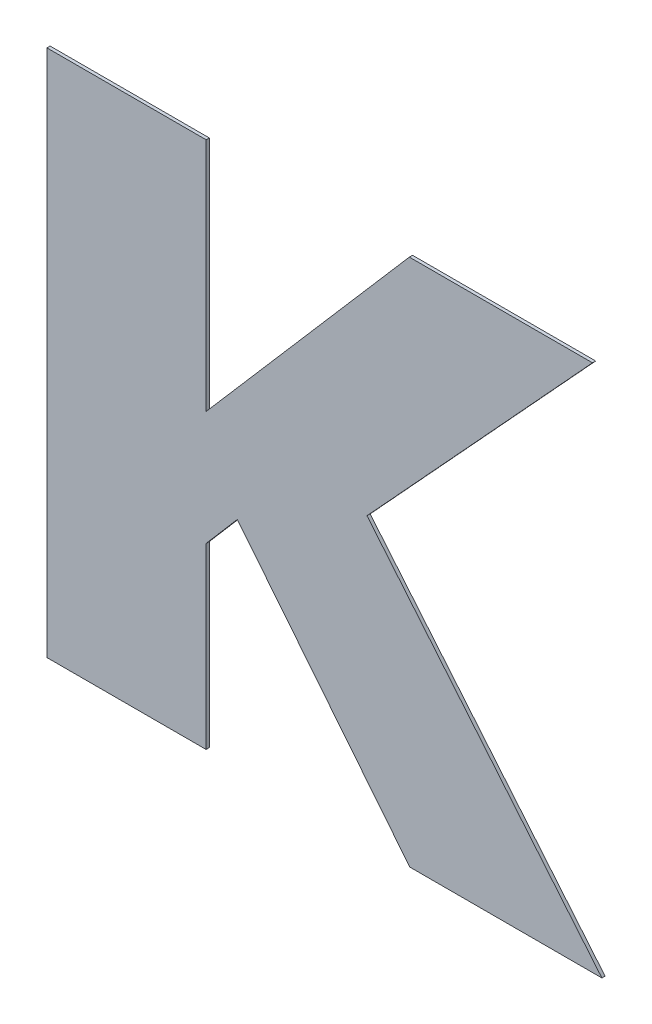
ISO-10303-21;
HEADER;
FILE_DESCRIPTION(('STEP AP214'),'2;1');
FILE_NAME('part.step','',(''),(''),'','','');
FILE_SCHEMA(('AUTOMOTIVE_DESIGN { 1 0 10303 214 1 1 1 1 }'));
ENDSEC;
DATA;
#1=APPLICATION_CONTEXT('core data for automotive mechanical design processes');
#2=APPLICATION_PROTOCOL_DEFINITION('international standard','automotive_design',2000,#1);
#3=PRODUCT_CONTEXT('',#1,'mechanical');
#4=PRODUCT('Part','Part','',(#3));
#5=PRODUCT_RELATED_PRODUCT_CATEGORY('part','',(#4));
#6=PRODUCT_DEFINITION_FORMATION('','',#4);
#7=PRODUCT_DEFINITION_CONTEXT('part definition',#1,'design');
#8=PRODUCT_DEFINITION('design','',#6,#7);
#9=PRODUCT_DEFINITION_SHAPE('','',#8);
#10=(LENGTH_UNIT() NAMED_UNIT(*) SI_UNIT(.MILLI.,.METRE.));
#11=(NAMED_UNIT(*) PLANE_ANGLE_UNIT() SI_UNIT($,.RADIAN.));
#12=(NAMED_UNIT(*) SI_UNIT($,.STERADIAN.) SOLID_ANGLE_UNIT());
#13=UNCERTAINTY_MEASURE_WITH_UNIT(LENGTH_MEASURE(1.E-05),#10,'distance_accuracy_value','');
#14=(GEOMETRIC_REPRESENTATION_CONTEXT(3) GLOBAL_UNCERTAINTY_ASSIGNED_CONTEXT((#13)) GLOBAL_UNIT_ASSIGNED_CONTEXT((#10,
#11,#12)) REPRESENTATION_CONTEXT('',''));
#15=CARTESIAN_POINT('',(0.,0.,0.));
#16=DIRECTION('',(0.,0.,1.));
#17=DIRECTION('',(1.,0.,0.));
#18=AXIS2_PLACEMENT_3D('',#15,#16,#17);
#19=CARTESIAN_POINT('',(2.058364911796,-2.493234605548,0.));
#20=DIRECTION('',(0.758626245570485,-0.65152606972525,0.));
#21=DIRECTION('',(0.65152606972525,0.758626245570485,0.));
#22=AXIS2_PLACEMENT_3D('',#19,#20,#21);
#23=PLANE('',#22);
#24=DIRECTION('',(0.65152606972525,0.758626245570484,0.));
#25=VECTOR('',#24,1.);
#26=CARTESIAN_POINT('',(2.058364911796,-2.493234605548,0.));
#27=LINE('',#26,#25);
#28=CARTESIAN_POINT('',(2.058364911796,-2.493234605548,0.));
#29=VERTEX_POINT('',#28);
#30=CARTESIAN_POINT('',(2.087918277855,-2.458823151917,0.));
#31=VERTEX_POINT('',#30);
#32=EDGE_CURVE('E11',#29,#31,#27,.T.);
#33=ORIENTED_EDGE('',*,*,#32,.T.);
#34=DIRECTION('',(0.,0.,1.));
#35=VECTOR('',#34,1.);
#36=CARTESIAN_POINT('',(2.087918277855,-2.458823151917,0.));
#37=LINE('',#36,#35);
#38=CARTESIAN_POINT('',(2.087918277855,-2.458823151917,0.003));
#39=VERTEX_POINT('',#38);
#40=EDGE_CURVE('E24',#31,#39,#37,.T.);
#41=ORIENTED_EDGE('',*,*,#40,.T.);
#42=DIRECTION('',(0.65152606972525,0.758626245570484,0.));
#43=VECTOR('',#42,1.);
#44=CARTESIAN_POINT('',(2.058364911796,-2.493234605548,0.003));
#45=LINE('',#44,#43);
#46=CARTESIAN_POINT('',(2.058364911796,-2.493234605548,0.003));
#47=VERTEX_POINT('',#46);
#48=EDGE_CURVE('E124',#47,#39,#45,.T.);
#49=ORIENTED_EDGE('',*,*,#48,.F.);
#50=DIRECTION('',(0.,0.,1.));
#51=VECTOR('',#50,1.);
#52=CARTESIAN_POINT('',(2.058364911796,-2.493234605548,0.));
#53=LINE('',#52,#51);
#54=EDGE_CURVE('E206',#29,#47,#53,.T.);
#55=ORIENTED_EDGE('',*,*,#54,.F.);
#56=EDGE_LOOP('',(#33,#41,#49,#55));
#57=FACE_BOUND('',#56,.T.);
#58=ADVANCED_FACE('F17',(#57),#23,.T.);
#59=CARTESIAN_POINT('',(2.058364911796,-2.662053148652,0.));
#60=DIRECTION('',(1.,0.,0.));
#61=DIRECTION('',(0.,1.,0.));
#62=AXIS2_PLACEMENT_3D('',#59,#60,#61);
#63=PLANE('',#62);
#64=DIRECTION('',(0.,1.,0.));
#65=VECTOR('',#64,1.);
#66=CARTESIAN_POINT('',(2.058364911796,-2.662053148652,0.));
#67=LINE('',#66,#65);
#68=CARTESIAN_POINT('',(2.058364911796,-2.662053148652,0.));
#69=VERTEX_POINT('',#68);
#70=EDGE_CURVE('E203',#69,#29,#67,.T.);
#71=ORIENTED_EDGE('',*,*,#70,.T.);
#72=ORIENTED_EDGE('',*,*,#54,.T.);
#73=DIRECTION('',(0.,1.,0.));
#74=VECTOR('',#73,1.);
#75=CARTESIAN_POINT('',(2.058364911796,-2.662053148652,0.003));
#76=LINE('',#75,#74);
#77=CARTESIAN_POINT('',(2.058364911796,-2.662053148652,0.003));
#78=VERTEX_POINT('',#77);
#79=EDGE_CURVE('E201',#78,#47,#76,.T.);
#80=ORIENTED_EDGE('',*,*,#79,.F.);
#81=DIRECTION('',(0.,0.,1.));
#82=VECTOR('',#81,1.);
#83=CARTESIAN_POINT('',(2.058364911796,-2.662053148652,0.));
#84=LINE('',#83,#82);
#85=EDGE_CURVE('E198',#69,#78,#84,.T.);
#86=ORIENTED_EDGE('',*,*,#85,.F.);
#87=EDGE_LOOP('',(#71,#72,#80,#86));
#88=FACE_BOUND('',#87,.T.);
#89=ADVANCED_FACE('F235',(#88),#63,.T.);
#90=CARTESIAN_POINT('',(1.907764197084,-2.662053148652,0.));
#91=DIRECTION('',(0.,-1.,0.));
#92=DIRECTION('',(1.,0.,0.));
#93=AXIS2_PLACEMENT_3D('',#90,#91,#92);
#94=PLANE('',#93);
#95=DIRECTION('',(1.,0.,0.));
#96=VECTOR('',#95,1.);
#97=CARTESIAN_POINT('',(1.907764197084,-2.662053148652,0.));
#98=LINE('',#97,#96);
#99=CARTESIAN_POINT('',(1.907764197084,-2.662053148652,0.));
#100=VERTEX_POINT('',#99);
#101=EDGE_CURVE('E195',#100,#69,#98,.T.);
#102=ORIENTED_EDGE('',*,*,#101,.T.);
#103=ORIENTED_EDGE('',*,*,#85,.T.);
#104=DIRECTION('',(1.,0.,0.));
#105=VECTOR('',#104,1.);
#106=CARTESIAN_POINT('',(1.907764197084,-2.662053148652,0.003));
#107=LINE('',#106,#105);
#108=CARTESIAN_POINT('',(1.907764197084,-2.662053148652,0.003));
#109=VERTEX_POINT('',#108);
#110=EDGE_CURVE('E192',#109,#78,#107,.T.);
#111=ORIENTED_EDGE('',*,*,#110,.F.);
#112=DIRECTION('',(0.,0.,1.));
#113=VECTOR('',#112,1.);
#114=CARTESIAN_POINT('',(1.907764197084,-2.662053148652,0.));
#115=LINE('',#114,#113);
#116=EDGE_CURVE('E189',#100,#109,#115,.T.);
#117=ORIENTED_EDGE('',*,*,#116,.F.);
#118=EDGE_LOOP('',(#102,#103,#111,#117));
#119=FACE_BOUND('',#118,.T.);
#120=ADVANCED_FACE('F232',(#119),#94,.T.);
#121=CARTESIAN_POINT('',(1.907764197084,-2.162479810064,0.));
#122=DIRECTION('',(-1.,0.,0.));
#123=DIRECTION('',(0.,-1.,0.));
#124=AXIS2_PLACEMENT_3D('',#121,#122,#123);
#125=PLANE('',#124);
#126=DIRECTION('',(0.,-1.,0.));
#127=VECTOR('',#126,1.);
#128=CARTESIAN_POINT('',(1.907764197084,-2.162479810064,0.));
#129=LINE('',#128,#127);
#130=CARTESIAN_POINT('',(1.907764197084,-2.162479810064,0.));
#131=VERTEX_POINT('',#130);
#132=EDGE_CURVE('E186',#131,#100,#129,.T.);
#133=ORIENTED_EDGE('',*,*,#132,.T.);
#134=ORIENTED_EDGE('',*,*,#116,.T.);
#135=DIRECTION('',(0.,-1.,0.));
#136=VECTOR('',#135,1.);
#137=CARTESIAN_POINT('',(1.907764197084,-2.162479810064,0.003));
#138=LINE('',#137,#136);
#139=CARTESIAN_POINT('',(1.907764197084,-2.162479810064,0.003));
#140=VERTEX_POINT('',#139);
#141=EDGE_CURVE('E183',#140,#109,#138,.T.);
#142=ORIENTED_EDGE('',*,*,#141,.F.);
#143=DIRECTION('',(0.,0.,1.));
#144=VECTOR('',#143,1.);
#145=CARTESIAN_POINT('',(1.907764197084,-2.162479810064,0.));
#146=LINE('',#145,#144);
#147=EDGE_CURVE('E180',#131,#140,#146,.T.);
#148=ORIENTED_EDGE('',*,*,#147,.F.);
#149=EDGE_LOOP('',(#133,#134,#142,#148));
#150=FACE_BOUND('',#149,.T.);
#151=ADVANCED_FACE('F229',(#150),#125,.T.);
#152=CARTESIAN_POINT('',(2.058364911796,-2.162479810064,0.));
#153=DIRECTION('',(0.,1.,0.));
#154=DIRECTION('',(-1.,0.,0.));
#155=AXIS2_PLACEMENT_3D('',#152,#153,#154);
#156=PLANE('',#155);
#157=DIRECTION('',(-1.,0.,0.));
#158=VECTOR('',#157,1.);
#159=CARTESIAN_POINT('',(2.058364911796,-2.162479810064,0.));
#160=LINE('',#159,#158);
#161=CARTESIAN_POINT('',(2.058364911796,-2.162479810064,0.));
#162=VERTEX_POINT('',#161);
#163=EDGE_CURVE('E177',#162,#131,#160,.T.);
#164=ORIENTED_EDGE('',*,*,#163,.T.);
#165=ORIENTED_EDGE('',*,*,#147,.T.);
#166=DIRECTION('',(-1.,0.,0.));
#167=VECTOR('',#166,1.);
#168=CARTESIAN_POINT('',(2.058364911796,-2.162479810064,0.003));
#169=LINE('',#168,#167);
#170=CARTESIAN_POINT('',(2.058364911796,-2.162479810064,0.003));
#171=VERTEX_POINT('',#170);
#172=EDGE_CURVE('E174',#171,#140,#169,.T.);
#173=ORIENTED_EDGE('',*,*,#172,.F.);
#174=DIRECTION('',(0.,0.,1.));
#175=VECTOR('',#174,1.);
#176=CARTESIAN_POINT('',(2.058364911796,-2.162479810064,0.));
#177=LINE('',#176,#175);
#178=EDGE_CURVE('E171',#162,#171,#177,.T.);
#179=ORIENTED_EDGE('',*,*,#178,.F.);
#180=EDGE_LOOP('',(#164,#165,#173,#179));
#181=FACE_BOUND('',#180,.T.);
#182=ADVANCED_FACE('F226',(#181),#156,.T.);
#183=CARTESIAN_POINT('',(2.058364911796,-2.385142157085,0.));
#184=DIRECTION('',(1.,0.,0.));
#185=DIRECTION('',(0.,1.,0.));
#186=AXIS2_PLACEMENT_3D('',#183,#184,#185);
#187=PLANE('',#186);
#188=DIRECTION('',(0.,1.,0.));
#189=VECTOR('',#188,1.);
#190=CARTESIAN_POINT('',(2.058364911796,-2.385142157085,0.));
#191=LINE('',#190,#189);
#192=CARTESIAN_POINT('',(2.058364911796,-2.385142157085,0.));
#193=VERTEX_POINT('',#192);
#194=EDGE_CURVE('E168',#193,#162,#191,.T.);
#195=ORIENTED_EDGE('',*,*,#194,.T.);
#196=ORIENTED_EDGE('',*,*,#178,.T.);
#197=DIRECTION('',(0.,1.,0.));
#198=VECTOR('',#197,1.);
#199=CARTESIAN_POINT('',(2.058364911796,-2.385142157085,0.003));
#200=LINE('',#199,#198);
#201=CARTESIAN_POINT('',(2.058364911796,-2.385142157085,0.003));
#202=VERTEX_POINT('',#201);
#203=EDGE_CURVE('E165',#202,#171,#200,.T.);
#204=ORIENTED_EDGE('',*,*,#203,.F.);
#205=DIRECTION('',(0.,0.,1.));
#206=VECTOR('',#205,1.);
#207=CARTESIAN_POINT('',(2.058364911796,-2.385142157085,0.));
#208=LINE('',#207,#206);
#209=EDGE_CURVE('E162',#193,#202,#208,.T.);
#210=ORIENTED_EDGE('',*,*,#209,.F.);
#211=EDGE_LOOP('',(#195,#196,#204,#210));
#212=FACE_BOUND('',#211,.T.);
#213=ADVANCED_FACE('F223',(#212),#187,.T.);
#214=CARTESIAN_POINT('',(2.250664211496,-2.162479810064,0.));
#215=DIRECTION('',(-0.756823007769158,0.653619870346094,0.));
#216=DIRECTION('',(-0.653619870346094,-0.756823007769158,0.));
#217=AXIS2_PLACEMENT_3D('',#214,#215,#216);
#218=PLANE('',#217);
#219=DIRECTION('',(-0.653619870346094,-0.756823007769158,0.));
#220=VECTOR('',#219,1.);
#221=CARTESIAN_POINT('',(2.250664211496,-2.162479810064,0.));
#222=LINE('',#221,#220);
#223=CARTESIAN_POINT('',(2.250664211496,-2.162479810064,0.));
#224=VERTEX_POINT('',#223);
#225=EDGE_CURVE('E159',#224,#193,#222,.T.);
#226=ORIENTED_EDGE('',*,*,#225,.T.);
#227=ORIENTED_EDGE('',*,*,#209,.T.);
#228=DIRECTION('',(-0.653619870346094,-0.756823007769158,0.));
#229=VECTOR('',#228,1.);
#230=CARTESIAN_POINT('',(2.250664211496,-2.162479810064,0.003));
#231=LINE('',#230,#229);
#232=CARTESIAN_POINT('',(2.250664211496,-2.162479810064,0.003));
#233=VERTEX_POINT('',#232);
#234=EDGE_CURVE('E156',#233,#202,#231,.T.);
#235=ORIENTED_EDGE('',*,*,#234,.F.);
#236=DIRECTION('',(0.,0.,1.));
#237=VECTOR('',#236,1.);
#238=CARTESIAN_POINT('',(2.250664211496,-2.162479810064,0.));
#239=LINE('',#238,#237);
#240=EDGE_CURVE('E153',#224,#233,#239,.T.);
#241=ORIENTED_EDGE('',*,*,#240,.F.);
#242=EDGE_LOOP('',(#226,#227,#235,#241));
#243=FACE_BOUND('',#242,.T.);
#244=ADVANCED_FACE('F220',(#243),#218,.T.);
#245=CARTESIAN_POINT('',(2.423936001541,-2.162479810064,0.));
#246=DIRECTION('',(0.,1.,0.));
#247=DIRECTION('',(-1.,0.,0.));
#248=AXIS2_PLACEMENT_3D('',#245,#246,#247);
#249=PLANE('',#248);
#250=DIRECTION('',(-1.,0.,0.));
#251=VECTOR('',#250,1.);
#252=CARTESIAN_POINT('',(2.423936001541,-2.162479810064,0.));
#253=LINE('',#252,#251);
#254=CARTESIAN_POINT('',(2.423936001541,-2.162479810064,0.));
#255=VERTEX_POINT('',#254);
#256=EDGE_CURVE('E150',#255,#224,#253,.T.);
#257=ORIENTED_EDGE('',*,*,#256,.T.);
#258=ORIENTED_EDGE('',*,*,#240,.T.);
#259=DIRECTION('',(-1.,0.,0.));
#260=VECTOR('',#259,1.);
#261=CARTESIAN_POINT('',(2.423936001541,-2.162479810064,0.003));
#262=LINE('',#261,#260);
#263=CARTESIAN_POINT('',(2.423936001541,-2.162479810064,0.003));
#264=VERTEX_POINT('',#263);
#265=EDGE_CURVE('E147',#264,#233,#262,.T.);
#266=ORIENTED_EDGE('',*,*,#265,.F.);
#267=DIRECTION('',(0.,0.,1.));
#268=VECTOR('',#267,1.);
#269=CARTESIAN_POINT('',(2.423936001541,-2.162479810064,0.));
#270=LINE('',#269,#268);
#271=EDGE_CURVE('E144',#255,#264,#270,.T.);
#272=ORIENTED_EDGE('',*,*,#271,.F.);
#273=EDGE_LOOP('',(#257,#258,#266,#272));
#274=FACE_BOUND('',#273,.T.);
#275=ADVANCED_FACE('F217',(#274),#249,.T.);
#276=CARTESIAN_POINT('',(2.210584989032,-2.394453491597,0.));
#277=DIRECTION('',(0.736033409231054,-0.676945212329411,0.));
#278=DIRECTION('',(0.676945212329411,0.736033409231054,0.));
#279=AXIS2_PLACEMENT_3D('',#276,#277,#278);
#280=PLANE('',#279);
#281=DIRECTION('',(0.676945212329411,0.736033409231054,0.));
#282=VECTOR('',#281,1.);
#283=CARTESIAN_POINT('',(2.210584989032,-2.394453491597,0.));
#284=LINE('',#283,#282);
#285=CARTESIAN_POINT('',(2.210584989032,-2.394453491597,0.));
#286=VERTEX_POINT('',#285);
#287=EDGE_CURVE('E141',#286,#255,#284,.T.);
#288=ORIENTED_EDGE('',*,*,#287,.T.);
#289=ORIENTED_EDGE('',*,*,#271,.T.);
#290=DIRECTION('',(0.676945212329411,0.736033409231054,0.));
#291=VECTOR('',#290,1.);
#292=CARTESIAN_POINT('',(2.210584989032,-2.394453491597,0.003));
#293=LINE('',#292,#291);
#294=CARTESIAN_POINT('',(2.210584989032,-2.394453491597,0.003));
#295=VERTEX_POINT('',#294);
#296=EDGE_CURVE('E138',#295,#264,#293,.T.);
#297=ORIENTED_EDGE('',*,*,#296,.F.);
#298=DIRECTION('',(0.,0.,1.));
#299=VECTOR('',#298,1.);
#300=CARTESIAN_POINT('',(2.210584989032,-2.394453491597,0.));
#301=LINE('',#300,#299);
#302=EDGE_CURVE('E135',#286,#295,#301,.T.);
#303=ORIENTED_EDGE('',*,*,#302,.F.);
#304=EDGE_LOOP('',(#288,#289,#297,#303));
#305=FACE_BOUND('',#304,.T.);
#306=ADVANCED_FACE('F214',(#305),#280,.T.);
#307=CARTESIAN_POINT('',(2.432842495422,-2.662053148652,0.));
#308=DIRECTION('',(0.76926957245945,0.638924349894457,0.));
#309=DIRECTION('',(-0.638924349894457,0.76926957245945,0.));
#310=AXIS2_PLACEMENT_3D('',#307,#308,#309);
#311=PLANE('',#310);
#312=DIRECTION('',(-0.638924349894457,0.76926957245945,0.));
#313=VECTOR('',#312,1.);
#314=CARTESIAN_POINT('',(2.432842495422,-2.662053148652,0.));
#315=LINE('',#314,#313);
#316=CARTESIAN_POINT('',(2.432842495422,-2.662053148652,0.));
#317=VERTEX_POINT('',#316);
#318=EDGE_CURVE('E132',#317,#286,#315,.T.);
#319=ORIENTED_EDGE('',*,*,#318,.T.);
#320=ORIENTED_EDGE('',*,*,#302,.T.);
#321=DIRECTION('',(-0.638924349894457,0.76926957245945,0.));
#322=VECTOR('',#321,1.);
#323=CARTESIAN_POINT('',(2.432842495422,-2.662053148652,0.003));
#324=LINE('',#323,#322);
#325=CARTESIAN_POINT('',(2.432842495422,-2.662053148652,0.003));
#326=VERTEX_POINT('',#325);
#327=EDGE_CURVE('E130',#326,#295,#324,.T.);
#328=ORIENTED_EDGE('',*,*,#327,.F.);
#329=DIRECTION('',(0.,0.,1.));
#330=VECTOR('',#329,1.);
#331=CARTESIAN_POINT('',(2.432842495422,-2.662053148652,0.));
#332=LINE('',#331,#330);
#333=EDGE_CURVE('E109',#317,#326,#332,.T.);
#334=ORIENTED_EDGE('',*,*,#333,.F.);
#335=EDGE_LOOP('',(#319,#320,#328,#334));
#336=FACE_BOUND('',#335,.T.);
#337=ADVANCED_FACE('F212',(#336),#311,.T.);
#338=CARTESIAN_POINT('',(2.251069052127,-2.662053148652,0.));
#339=DIRECTION('',(0.,-1.,0.));
#340=DIRECTION('',(1.,0.,0.));
#341=AXIS2_PLACEMENT_3D('',#338,#339,#340);
#342=PLANE('',#341);
#343=DIRECTION('',(1.,0.,0.));
#344=VECTOR('',#343,1.);
#345=CARTESIAN_POINT('',(2.251069052127,-2.662053148652,0.));
#346=LINE('',#345,#344);
#347=CARTESIAN_POINT('',(2.251069052127,-2.662053148652,0.));
#348=VERTEX_POINT('',#347);
#349=EDGE_CURVE('E113',#348,#317,#346,.T.);
#350=ORIENTED_EDGE('',*,*,#349,.T.);
#351=ORIENTED_EDGE('',*,*,#333,.T.);
#352=DIRECTION('',(1.,0.,0.));
#353=VECTOR('',#352,1.);
#354=CARTESIAN_POINT('',(2.251069052127,-2.662053148652,0.003));
#355=LINE('',#354,#353);
#356=CARTESIAN_POINT('',(2.251069052127,-2.662053148652,0.003));
#357=VERTEX_POINT('',#356);
#358=EDGE_CURVE('E102',#357,#326,#355,.T.);
#359=ORIENTED_EDGE('',*,*,#358,.F.);
#360=DIRECTION('',(0.,0.,1.));
#361=VECTOR('',#360,1.);
#362=CARTESIAN_POINT('',(2.251069052127,-2.662053148652,0.));
#363=LINE('',#362,#361);
#364=EDGE_CURVE('E106',#348,#357,#363,.T.);
#365=ORIENTED_EDGE('',*,*,#364,.F.);
#366=EDGE_LOOP('',(#350,#351,#359,#365));
#367=FACE_BOUND('',#366,.T.);
#368=ADVANCED_FACE('F105',(#367),#342,.T.);
#369=CARTESIAN_POINT('',(2.087918277855,-2.458823151917,0.));
#370=DIRECTION('',(-0.77980682490146,-0.626020219990619,0.));
#371=DIRECTION('',(0.626020219990619,-0.77980682490146,0.));
#372=AXIS2_PLACEMENT_3D('',#369,#370,#371);
#373=PLANE('',#372);
#374=DIRECTION('',(0.626020219990619,-0.77980682490146,0.));
#375=VECTOR('',#374,1.);
#376=CARTESIAN_POINT('',(2.087918277855,-2.458823151917,0.));
#377=LINE('',#376,#375);
#378=EDGE_CURVE('E119',#31,#348,#377,.T.);
#379=ORIENTED_EDGE('',*,*,#378,.T.);
#380=ORIENTED_EDGE('',*,*,#364,.T.);
#381=DIRECTION('',(0.626020219990619,-0.77980682490146,0.));
#382=VECTOR('',#381,1.);
#383=CARTESIAN_POINT('',(2.087918277855,-2.458823151917,0.003));
#384=LINE('',#383,#382);
#385=EDGE_CURVE('E118',#39,#357,#384,.T.);
#386=ORIENTED_EDGE('',*,*,#385,.F.);
#387=ORIENTED_EDGE('',*,*,#40,.F.);
#388=EDGE_LOOP('',(#379,#380,#386,#387));
#389=FACE_BOUND('',#388,.T.);
#390=ADVANCED_FACE('F117',(#389),#373,.T.);
#391=CARTESIAN_POINT('',(2.170303346253,-2.412266479358,0.003));
#392=DIRECTION('',(0.,0.,1.));
#393=DIRECTION('',(1.,0.,0.));
#394=AXIS2_PLACEMENT_3D('',#391,#392,#393);
#395=PLANE('',#394);
#396=ORIENTED_EDGE('',*,*,#385,.T.);
#397=ORIENTED_EDGE('',*,*,#358,.T.);
#398=ORIENTED_EDGE('',*,*,#327,.T.);
#399=ORIENTED_EDGE('',*,*,#296,.T.);
#400=ORIENTED_EDGE('',*,*,#265,.T.);
#401=ORIENTED_EDGE('',*,*,#234,.T.);
#402=ORIENTED_EDGE('',*,*,#203,.T.);
#403=ORIENTED_EDGE('',*,*,#172,.T.);
#404=ORIENTED_EDGE('',*,*,#141,.T.);
#405=ORIENTED_EDGE('',*,*,#110,.T.);
#406=ORIENTED_EDGE('',*,*,#79,.T.);
#407=ORIENTED_EDGE('',*,*,#48,.T.);
#408=EDGE_LOOP('',(#396,#397,#398,#399,#400,#401,#402,#403,#404,#405,#406,#407));
#409=FACE_BOUND('',#408,.T.);
#410=ADVANCED_FACE('F122',(#409),#395,.T.);
#411=CARTESIAN_POINT('',(2.170303346253,-2.412266479358,0.));
#412=DIRECTION('',(0.,0.,1.));
#413=DIRECTION('',(1.,0.,0.));
#414=AXIS2_PLACEMENT_3D('',#411,#412,#413);
#415=PLANE('',#414);
#416=ORIENTED_EDGE('',*,*,#378,.F.);
#417=ORIENTED_EDGE('',*,*,#32,.F.);
#418=ORIENTED_EDGE('',*,*,#70,.F.);
#419=ORIENTED_EDGE('',*,*,#101,.F.);
#420=ORIENTED_EDGE('',*,*,#132,.F.);
#421=ORIENTED_EDGE('',*,*,#163,.F.);
#422=ORIENTED_EDGE('',*,*,#194,.F.);
#423=ORIENTED_EDGE('',*,*,#225,.F.);
#424=ORIENTED_EDGE('',*,*,#256,.F.);
#425=ORIENTED_EDGE('',*,*,#287,.F.);
#426=ORIENTED_EDGE('',*,*,#318,.F.);
#427=ORIENTED_EDGE('',*,*,#349,.F.);
#428=EDGE_LOOP('',(#416,#417,#418,#419,#420,#421,#422,#423,#424,#425,#426,#427));
#429=FACE_BOUND('',#428,.T.);
#430=ADVANCED_FACE('F209',(#429),#415,.F.);
#431=CLOSED_SHELL('',(#58,#89,#120,#151,#182,#213,#244,#275,#306,#337,#368,#390,#410,#430));
#432=MANIFOLD_SOLID_BREP('B1',#431);
#433=ADVANCED_BREP_SHAPE_REPRESENTATION('',(#18,#432),#14);
#434=SHAPE_DEFINITION_REPRESENTATION(#9,#433);
ENDSEC;
END-ISO-10303-21;
